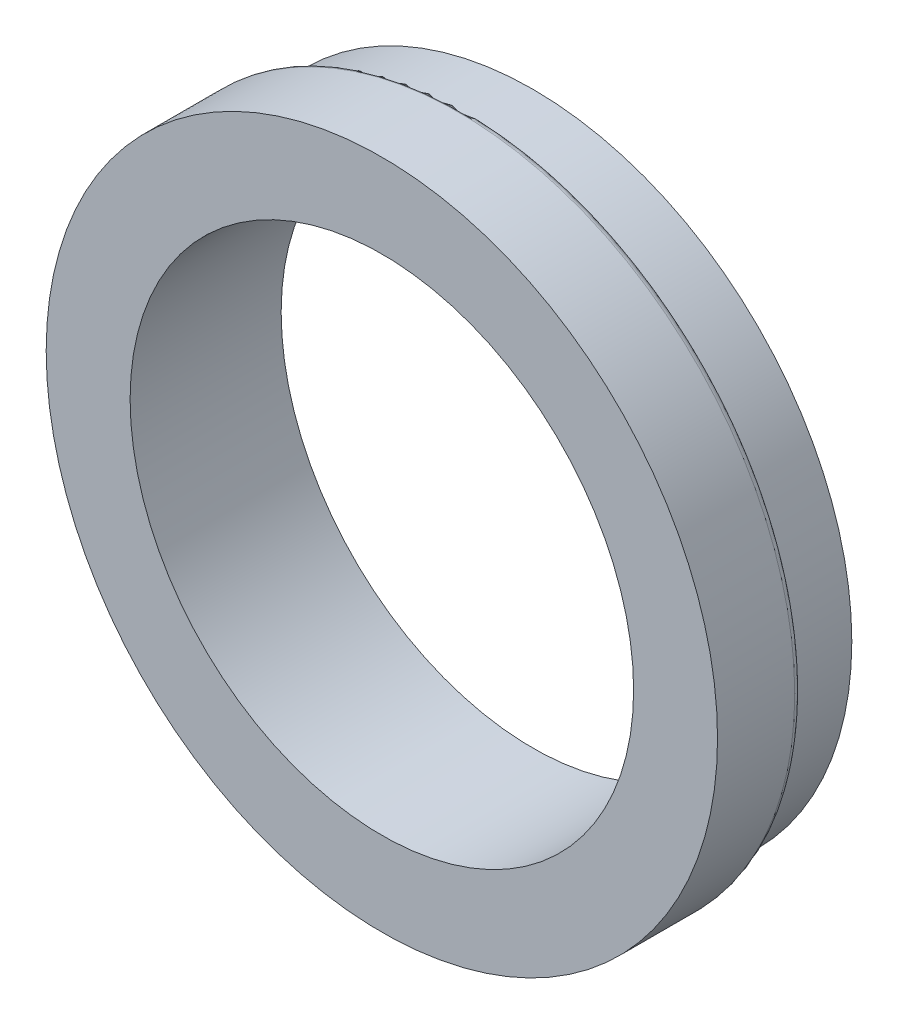
ISO-10303-21;
HEADER;
FILE_DESCRIPTION(('STEP AP214'),'2;1');
FILE_NAME('part.step','',(''),(''),'','','');
FILE_SCHEMA(('AUTOMOTIVE_DESIGN { 1 0 10303 214 1 1 1 1 }'));
ENDSEC;
DATA;
#1=APPLICATION_CONTEXT('core data for automotive mechanical design processes');
#2=APPLICATION_PROTOCOL_DEFINITION('international standard','automotive_design',2000,#1);
#3=PRODUCT_CONTEXT('',#1,'mechanical');
#4=PRODUCT('Part','Part','',(#3));
#5=PRODUCT_RELATED_PRODUCT_CATEGORY('part','',(#4));
#6=PRODUCT_DEFINITION_FORMATION('','',#4);
#7=PRODUCT_DEFINITION_CONTEXT('part definition',#1,'design');
#8=PRODUCT_DEFINITION('design','',#6,#7);
#9=PRODUCT_DEFINITION_SHAPE('','',#8);
#10=(LENGTH_UNIT() NAMED_UNIT(*) SI_UNIT(.MILLI.,.METRE.));
#11=(NAMED_UNIT(*) PLANE_ANGLE_UNIT() SI_UNIT($,.RADIAN.));
#12=(NAMED_UNIT(*) SI_UNIT($,.STERADIAN.) SOLID_ANGLE_UNIT());
#13=UNCERTAINTY_MEASURE_WITH_UNIT(LENGTH_MEASURE(1.E-05),#10,'distance_accuracy_value','');
#14=(GEOMETRIC_REPRESENTATION_CONTEXT(3) GLOBAL_UNCERTAINTY_ASSIGNED_CONTEXT((#13)) GLOBAL_UNIT_ASSIGNED_CONTEXT((#10,
#11,#12)) REPRESENTATION_CONTEXT('',''));
#15=CARTESIAN_POINT('',(0.,0.,0.));
#16=DIRECTION('',(0.,0.,1.));
#17=DIRECTION('',(1.,0.,0.));
#18=AXIS2_PLACEMENT_3D('',#15,#16,#17);
#19=CARTESIAN_POINT('',(0.,0.,0.));
#20=DIRECTION('',(0.,0.,1.));
#21=DIRECTION('',(1.,0.,0.));
#22=AXIS2_PLACEMENT_3D('',#19,#20,#21);
#23=PLANE('',#22);
#24=CARTESIAN_POINT('',(0.,0.,0.));
#25=DIRECTION('',(0.,0.,1.));
#26=DIRECTION('',(1.,0.,0.));
#27=AXIS2_PLACEMENT_3D('',#24,#25,#26);
#28=CIRCLE('',#27,95.);
#29=CARTESIAN_POINT('',(95.,0.,0.));
#30=VERTEX_POINT('',#29);
#31=EDGE_CURVE('E60',#30,#30,#28,.T.);
#32=ORIENTED_EDGE('',*,*,#31,.F.);
#33=EDGE_LOOP('',(#32));
#34=FACE_BOUND('',#33,.T.);
#35=CARTESIAN_POINT('',(0.,0.,0.));
#36=DIRECTION('',(0.,0.,1.));
#37=DIRECTION('',(1.,0.,0.));
#38=AXIS2_PLACEMENT_3D('',#35,#36,#37);
#39=CIRCLE('',#38,75.);
#40=CARTESIAN_POINT('',(75.,0.,0.));
#41=VERTEX_POINT('',#40);
#42=EDGE_CURVE('E63',#41,#41,#39,.T.);
#43=ORIENTED_EDGE('',*,*,#42,.T.);
#44=EDGE_LOOP('',(#43));
#45=FACE_BOUND('',#44,.T.);
#46=ADVANCED_FACE('F40',(#34,#45),#23,.F.);
#47=CARTESIAN_POINT('',(0.,0.,20.));
#48=DIRECTION('',(0.,0.,-1.));
#49=DIRECTION('',(-1.,0.,0.));
#50=AXIS2_PLACEMENT_3D('',#47,#48,#49);
#51=CYLINDRICAL_SURFACE('',#50,95.);
#52=CARTESIAN_POINT('',(0.,0.,18.));
#53=DIRECTION('',(0.,0.,-1.));
#54=DIRECTION('',(-1.,0.,0.));
#55=AXIS2_PLACEMENT_3D('',#52,#53,#54);
#56=CIRCLE('',#55,95.);
#57=CARTESIAN_POINT('',(-95.,0.,18.));
#58=VERTEX_POINT('',#57);
#59=EDGE_CURVE('E47',#58,#58,#56,.T.);
#60=ORIENTED_EDGE('',*,*,#59,.T.);
#61=EDGE_LOOP('',(#60));
#62=FACE_BOUND('',#61,.T.);
#63=ORIENTED_EDGE('',*,*,#31,.T.);
#64=EDGE_LOOP('',(#63));
#65=FACE_BOUND('',#64,.T.);
#66=ADVANCED_FACE('F91',(#62,#65),#51,.T.);
#67=CARTESIAN_POINT('',(0.,0.,20.));
#68=DIRECTION('',(0.,0.,-1.));
#69=DIRECTION('',(-1.,0.,0.));
#70=AXIS2_PLACEMENT_3D('',#67,#68,#69);
#71=CYLINDRICAL_SURFACE('',#70,75.);
#72=ORIENTED_EDGE('',*,*,#42,.F.);
#73=EDGE_LOOP('',(#72));
#74=FACE_BOUND('',#73,.T.);
#75=CARTESIAN_POINT('',(0.,0.,45.));
#76=DIRECTION('',(0.,0.,1.));
#77=DIRECTION('',(1.,0.,0.));
#78=AXIS2_PLACEMENT_3D('',#75,#76,#77);
#79=CIRCLE('',#78,75.);
#80=CARTESIAN_POINT('',(75.,0.,45.));
#81=VERTEX_POINT('',#80);
#82=EDGE_CURVE('E69',#81,#81,#79,.T.);
#83=ORIENTED_EDGE('',*,*,#82,.T.);
#84=EDGE_LOOP('',(#83));
#85=FACE_BOUND('',#84,.T.);
#86=ADVANCED_FACE('F73',(#74,#85),#71,.F.);
#87=CARTESIAN_POINT('',(75.,0.,20.));
#88=DIRECTION('',(0.,0.,-1.));
#89=DIRECTION('',(-1.,0.,0.));
#90=AXIS2_PLACEMENT_3D('',#87,#88,#89);
#91=PLANE('',#90);
#92=CARTESIAN_POINT('',(0.,0.,20.));
#93=DIRECTION('',(0.,0.,-1.));
#94=DIRECTION('',(-1.,0.,0.));
#95=AXIS2_PLACEMENT_3D('',#92,#93,#94);
#96=CIRCLE('',#95,97.);
#97=CARTESIAN_POINT('',(-97.,0.,20.));
#98=VERTEX_POINT('',#97);
#99=EDGE_CURVE('E51',#98,#98,#96,.F.);
#100=ORIENTED_EDGE('',*,*,#99,.T.);
#101=EDGE_LOOP('',(#100));
#102=FACE_BOUND('',#101,.T.);
#103=CARTESIAN_POINT('',(0.,0.,20.));
#104=DIRECTION('',(0.,0.,-1.));
#105=DIRECTION('',(-1.,0.,0.));
#106=AXIS2_PLACEMENT_3D('',#103,#104,#105);
#107=CIRCLE('',#106,98.);
#108=CARTESIAN_POINT('',(-98.,0.,20.));
#109=VERTEX_POINT('',#108);
#110=EDGE_CURVE('E55',#109,#109,#107,.T.);
#111=ORIENTED_EDGE('',*,*,#110,.T.);
#112=EDGE_LOOP('',(#111));
#113=FACE_BOUND('',#112,.T.);
#114=ADVANCED_FACE('F88',(#102,#113),#91,.T.);
#115=CARTESIAN_POINT('',(0.,0.,20.));
#116=DIRECTION('',(0.,0.,1.));
#117=DIRECTION('',(1.,0.,0.));
#118=AXIS2_PLACEMENT_3D('',#115,#116,#117);
#119=CYLINDRICAL_SURFACE('',#118,100.);
#120=CARTESIAN_POINT('',(0.,0.,22.));
#121=DIRECTION('',(0.,0.,-1.));
#122=DIRECTION('',(-1.,0.,0.));
#123=AXIS2_PLACEMENT_3D('',#120,#121,#122);
#124=CIRCLE('',#123,100.);
#125=CARTESIAN_POINT('',(-100.,0.,22.));
#126=VERTEX_POINT('',#125);
#127=EDGE_CURVE('E10',#126,#126,#124,.F.);
#128=ORIENTED_EDGE('',*,*,#127,.T.);
#129=EDGE_LOOP('',(#128));
#130=FACE_BOUND('',#129,.T.);
#131=CARTESIAN_POINT('',(0.,0.,45.));
#132=DIRECTION('',(0.,0.,1.));
#133=DIRECTION('',(1.,0.,0.));
#134=AXIS2_PLACEMENT_3D('',#131,#132,#133);
#135=CIRCLE('',#134,100.);
#136=CARTESIAN_POINT('',(100.,0.,45.));
#137=VERTEX_POINT('',#136);
#138=EDGE_CURVE('E66',#137,#137,#135,.T.);
#139=ORIENTED_EDGE('',*,*,#138,.F.);
#140=EDGE_LOOP('',(#139));
#141=FACE_BOUND('',#140,.T.);
#142=ADVANCED_FACE('F78',(#130,#141),#119,.T.);
#143=CARTESIAN_POINT('',(100.,0.,45.));
#144=DIRECTION('',(0.,0.,1.));
#145=DIRECTION('',(1.,0.,0.));
#146=AXIS2_PLACEMENT_3D('',#143,#144,#145);
#147=PLANE('',#146);
#148=ORIENTED_EDGE('',*,*,#138,.T.);
#149=EDGE_LOOP('',(#148));
#150=FACE_BOUND('',#149,.T.);
#151=ORIENTED_EDGE('',*,*,#82,.F.);
#152=EDGE_LOOP('',(#151));
#153=FACE_BOUND('',#152,.T.);
#154=ADVANCED_FACE('F75',(#150,#153),#147,.T.);
#155=CARTESIAN_POINT('',(0.,0.,18.));
#156=DIRECTION('',(0.,0.,-1.));
#157=DIRECTION('',(-1.,0.,0.));
#158=AXIS2_PLACEMENT_3D('',#155,#156,#157);
#159=TOROIDAL_SURFACE('',#158,97.,2.);
#160=ORIENTED_EDGE('',*,*,#59,.F.);
#161=EDGE_LOOP('',(#160));
#162=FACE_BOUND('',#161,.T.);
#163=ORIENTED_EDGE('',*,*,#99,.F.);
#164=EDGE_LOOP('',(#163));
#165=FACE_BOUND('',#164,.T.);
#166=ADVANCED_FACE('F77',(#162,#165),#159,.F.);
#167=CARTESIAN_POINT('',(0.,0.,22.));
#168=DIRECTION('',(0.,0.,-1.));
#169=DIRECTION('',(-1.,0.,0.));
#170=AXIS2_PLACEMENT_3D('',#167,#168,#169);
#171=TOROIDAL_SURFACE('',#170,98.,2.);
#172=ORIENTED_EDGE('',*,*,#110,.F.);
#173=EDGE_LOOP('',(#172));
#174=FACE_BOUND('',#173,.T.);
#175=ORIENTED_EDGE('',*,*,#127,.F.);
#176=EDGE_LOOP('',(#175));
#177=FACE_BOUND('',#176,.T.);
#178=ADVANCED_FACE('F42',(#174,#177),#171,.T.);
#179=CLOSED_SHELL('',(#46,#66,#86,#114,#142,#154,#166,#178));
#180=MANIFOLD_SOLID_BREP('B2',#179);
#181=ADVANCED_BREP_SHAPE_REPRESENTATION('',(#18,#180),#14);
#182=SHAPE_DEFINITION_REPRESENTATION(#9,#181);
ENDSEC;
END-ISO-10303-21;
